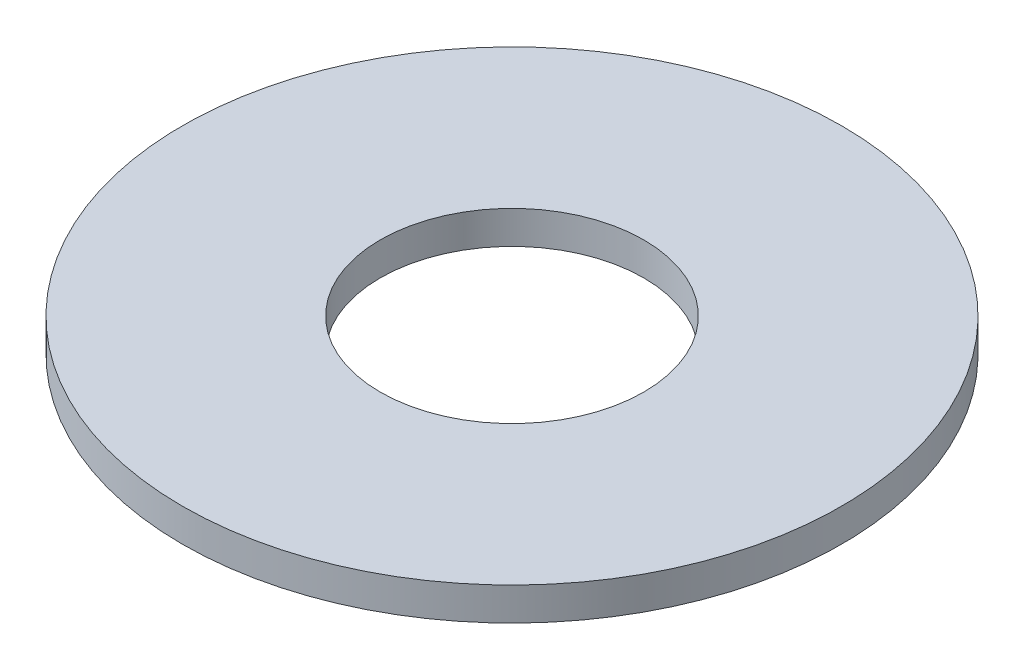
ISO-10303-21;
HEADER;
FILE_DESCRIPTION(('STEP AP214'),'2;1');
FILE_NAME('part.step','',(''),(''),'','','');
FILE_SCHEMA(('AUTOMOTIVE_DESIGN { 1 0 10303 214 1 1 1 1 }'));
ENDSEC;
DATA;
#1=APPLICATION_CONTEXT('core data for automotive mechanical design processes');
#2=APPLICATION_PROTOCOL_DEFINITION('international standard','automotive_design',2000,#1);
#3=PRODUCT_CONTEXT('',#1,'mechanical');
#4=PRODUCT('Part','Part','',(#3));
#5=PRODUCT_RELATED_PRODUCT_CATEGORY('part','',(#4));
#6=PRODUCT_DEFINITION_FORMATION('','',#4);
#7=PRODUCT_DEFINITION_CONTEXT('part definition',#1,'design');
#8=PRODUCT_DEFINITION('design','',#6,#7);
#9=PRODUCT_DEFINITION_SHAPE('','',#8);
#10=(LENGTH_UNIT() NAMED_UNIT(*) SI_UNIT(.MILLI.,.METRE.));
#11=(NAMED_UNIT(*) PLANE_ANGLE_UNIT() SI_UNIT($,.RADIAN.));
#12=(NAMED_UNIT(*) SI_UNIT($,.STERADIAN.) SOLID_ANGLE_UNIT());
#13=UNCERTAINTY_MEASURE_WITH_UNIT(LENGTH_MEASURE(1.E-05),#10,'distance_accuracy_value','');
#14=(GEOMETRIC_REPRESENTATION_CONTEXT(3) GLOBAL_UNCERTAINTY_ASSIGNED_CONTEXT((#13)) GLOBAL_UNIT_ASSIGNED_CONTEXT((#10,
#11,#12)) REPRESENTATION_CONTEXT('',''));
#15=CARTESIAN_POINT('',(0.,0.,0.));
#16=DIRECTION('',(0.,0.,1.));
#17=DIRECTION('',(1.,0.,0.));
#18=AXIS2_PLACEMENT_3D('',#15,#16,#17);
#19=CARTESIAN_POINT('',(0.,1.,0.));
#20=DIRECTION('',(0.,1.,0.));
#21=DIRECTION('',(0.,0.,1.));
#22=AXIS2_PLACEMENT_3D('',#19,#20,#21);
#23=PLANE('',#22);
#24=CARTESIAN_POINT('',(0.,1.,0.));
#25=DIRECTION('',(0.,1.,0.));
#26=DIRECTION('',(0.,0.,1.));
#27=AXIS2_PLACEMENT_3D('',#24,#25,#26);
#28=CIRCLE('',#27,10.);
#29=CARTESIAN_POINT('',(0.,1.,10.));
#30=VERTEX_POINT('',#29);
#31=EDGE_CURVE('E10',#30,#30,#28,.T.);
#32=ORIENTED_EDGE('',*,*,#31,.T.);
#33=EDGE_LOOP('',(#32));
#34=FACE_BOUND('',#33,.T.);
#35=CARTESIAN_POINT('',(0.,1.,0.));
#36=DIRECTION('',(0.,1.,0.));
#37=DIRECTION('',(0.,0.,1.));
#38=AXIS2_PLACEMENT_3D('',#35,#36,#37);
#39=CIRCLE('',#38,4.);
#40=CARTESIAN_POINT('',(0.,1.,4.));
#41=VERTEX_POINT('',#40);
#42=EDGE_CURVE('E56',#41,#41,#39,.T.);
#43=ORIENTED_EDGE('',*,*,#42,.F.);
#44=EDGE_LOOP('',(#43));
#45=FACE_BOUND('',#44,.T.);
#46=ADVANCED_FACE('F43',(#34,#45),#23,.T.);
#47=CARTESIAN_POINT('',(0.,0.,0.));
#48=DIRECTION('',(0.,1.,0.));
#49=DIRECTION('',(0.,0.,1.));
#50=AXIS2_PLACEMENT_3D('',#47,#48,#49);
#51=PLANE('',#50);
#52=CARTESIAN_POINT('',(0.,0.,0.));
#53=DIRECTION('',(0.,1.,0.));
#54=DIRECTION('',(0.,0.,1.));
#55=AXIS2_PLACEMENT_3D('',#52,#53,#54);
#56=CIRCLE('',#55,10.);
#57=CARTESIAN_POINT('',(0.,0.,10.));
#58=VERTEX_POINT('',#57);
#59=EDGE_CURVE('E47',#58,#58,#56,.T.);
#60=ORIENTED_EDGE('',*,*,#59,.F.);
#61=EDGE_LOOP('',(#60));
#62=FACE_BOUND('',#61,.T.);
#63=CARTESIAN_POINT('',(0.,0.,0.));
#64=DIRECTION('',(0.,1.,0.));
#65=DIRECTION('',(0.,0.,1.));
#66=AXIS2_PLACEMENT_3D('',#63,#64,#65);
#67=CIRCLE('',#66,4.);
#68=CARTESIAN_POINT('',(0.,0.,4.));
#69=VERTEX_POINT('',#68);
#70=EDGE_CURVE('E58',#69,#69,#67,.T.);
#71=ORIENTED_EDGE('',*,*,#70,.T.);
#72=EDGE_LOOP('',(#71));
#73=FACE_BOUND('',#72,.T.);
#74=ADVANCED_FACE('F70',(#62,#73),#51,.F.);
#75=CARTESIAN_POINT('',(0.,1.,0.));
#76=DIRECTION('',(0.,-1.,0.));
#77=DIRECTION('',(0.,0.,-1.));
#78=AXIS2_PLACEMENT_3D('',#75,#76,#77);
#79=CYLINDRICAL_SURFACE('',#78,10.);
#80=ORIENTED_EDGE('',*,*,#31,.F.);
#81=EDGE_LOOP('',(#80));
#82=FACE_BOUND('',#81,.T.);
#83=ORIENTED_EDGE('',*,*,#59,.T.);
#84=EDGE_LOOP('',(#83));
#85=FACE_BOUND('',#84,.T.);
#86=ADVANCED_FACE('F45',(#82,#85),#79,.T.);
#87=CARTESIAN_POINT('',(0.,1.,0.));
#88=DIRECTION('',(0.,-1.,0.));
#89=DIRECTION('',(0.,0.,-1.));
#90=AXIS2_PLACEMENT_3D('',#87,#88,#89);
#91=CYLINDRICAL_SURFACE('',#90,4.);
#92=ORIENTED_EDGE('',*,*,#42,.T.);
#93=EDGE_LOOP('',(#92));
#94=FACE_BOUND('',#93,.T.);
#95=ORIENTED_EDGE('',*,*,#70,.F.);
#96=EDGE_LOOP('',(#95));
#97=FACE_BOUND('',#96,.T.);
#98=ADVANCED_FACE('F66',(#94,#97),#91,.F.);
#99=CLOSED_SHELL('',(#46,#74,#86,#98));
#100=MANIFOLD_SOLID_BREP('B2',#99);
#101=ADVANCED_BREP_SHAPE_REPRESENTATION('',(#18,#100),#14);
#102=SHAPE_DEFINITION_REPRESENTATION(#9,#101);
ENDSEC;
END-ISO-10303-21;
